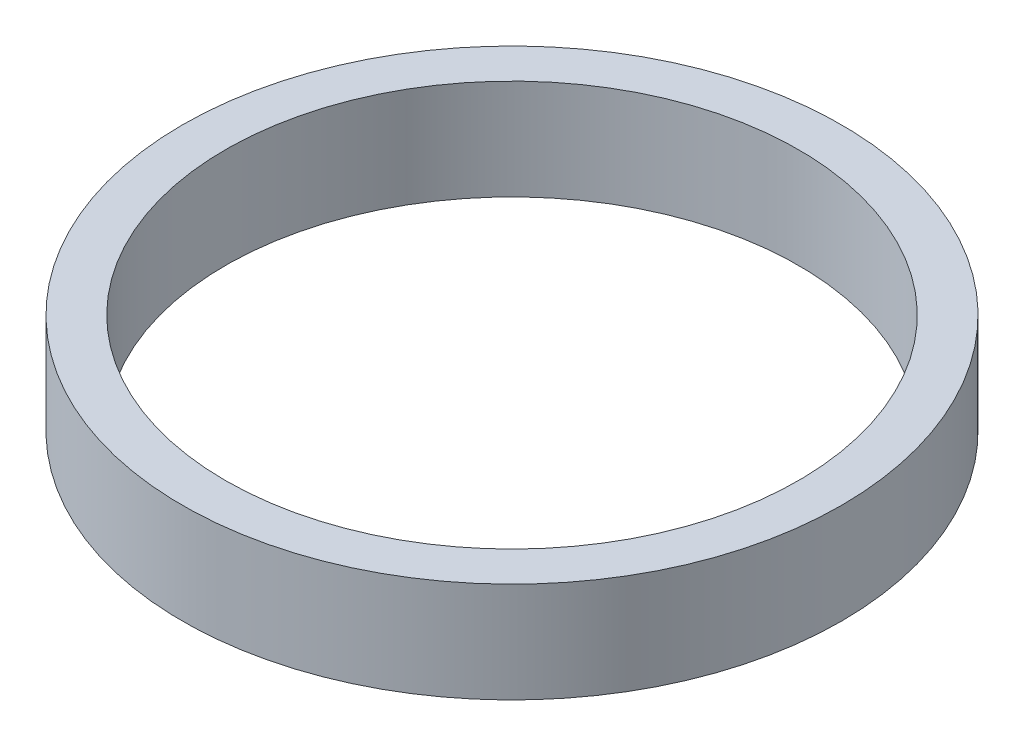
ISO-10303-21;
HEADER;
FILE_DESCRIPTION(('STEP AP214'),'2;1');
FILE_NAME('part.step','',(''),(''),'','','');
FILE_SCHEMA(('AUTOMOTIVE_DESIGN { 1 0 10303 214 1 1 1 1 }'));
ENDSEC;
DATA;
#1=APPLICATION_CONTEXT('core data for automotive mechanical design processes');
#2=APPLICATION_PROTOCOL_DEFINITION('international standard','automotive_design',2000,#1);
#3=PRODUCT_CONTEXT('',#1,'mechanical');
#4=PRODUCT('Part','Part','',(#3));
#5=PRODUCT_RELATED_PRODUCT_CATEGORY('part','',(#4));
#6=PRODUCT_DEFINITION_FORMATION('','',#4);
#7=PRODUCT_DEFINITION_CONTEXT('part definition',#1,'design');
#8=PRODUCT_DEFINITION('design','',#6,#7);
#9=PRODUCT_DEFINITION_SHAPE('','',#8);
#10=(LENGTH_UNIT() NAMED_UNIT(*) SI_UNIT(.MILLI.,.METRE.));
#11=(NAMED_UNIT(*) PLANE_ANGLE_UNIT() SI_UNIT($,.RADIAN.));
#12=(NAMED_UNIT(*) SI_UNIT($,.STERADIAN.) SOLID_ANGLE_UNIT());
#13=UNCERTAINTY_MEASURE_WITH_UNIT(LENGTH_MEASURE(1.E-05),#10,'distance_accuracy_value','');
#14=(GEOMETRIC_REPRESENTATION_CONTEXT(3) GLOBAL_UNCERTAINTY_ASSIGNED_CONTEXT((#13)) GLOBAL_UNIT_ASSIGNED_CONTEXT((#10,
#11,#12)) REPRESENTATION_CONTEXT('',''));
#15=CARTESIAN_POINT('',(0.,0.,0.));
#16=DIRECTION('',(0.,0.,1.));
#17=DIRECTION('',(1.,0.,0.));
#18=AXIS2_PLACEMENT_3D('',#15,#16,#17);
#19=CARTESIAN_POINT('',(0.,3.5,0.));
#20=DIRECTION('',(0.,1.,0.));
#21=DIRECTION('',(0.,0.,1.));
#22=AXIS2_PLACEMENT_3D('',#19,#20,#21);
#23=PLANE('',#22);
#24=CARTESIAN_POINT('',(0.,3.5,0.));
#25=DIRECTION('',(0.,1.,0.));
#26=DIRECTION('',(1.,0.,0.));
#27=AXIS2_PLACEMENT_3D('',#24,#25,#26);
#28=CIRCLE('',#27,11.5);
#29=CARTESIAN_POINT('',(11.5,3.5,0.));
#30=VERTEX_POINT('',#29);
#31=EDGE_CURVE('E13',#30,#30,#28,.T.);
#32=ORIENTED_EDGE('',*,*,#31,.T.);
#33=EDGE_LOOP('',(#32));
#34=FACE_BOUND('',#33,.T.);
#35=CARTESIAN_POINT('',(0.,3.5,0.));
#36=DIRECTION('',(0.,1.,0.));
#37=DIRECTION('',(0.,0.,1.));
#38=AXIS2_PLACEMENT_3D('',#35,#36,#37);
#39=CIRCLE('',#38,10.);
#40=CARTESIAN_POINT('',(0.,3.5,10.));
#41=VERTEX_POINT('',#40);
#42=EDGE_CURVE('E63',#41,#41,#39,.T.);
#43=ORIENTED_EDGE('',*,*,#42,.F.);
#44=EDGE_LOOP('',(#43));
#45=FACE_BOUND('',#44,.T.);
#46=ADVANCED_FACE('F52',(#34,#45),#23,.T.);
#47=CARTESIAN_POINT('',(0.,0.,0.));
#48=DIRECTION('',(0.,1.,0.));
#49=DIRECTION('',(0.,0.,1.));
#50=AXIS2_PLACEMENT_3D('',#47,#48,#49);
#51=PLANE('',#50);
#52=CARTESIAN_POINT('',(0.,0.,0.));
#53=DIRECTION('',(0.,1.,0.));
#54=DIRECTION('',(1.,0.,0.));
#55=AXIS2_PLACEMENT_3D('',#52,#53,#54);
#56=CIRCLE('',#55,11.5);
#57=CARTESIAN_POINT('',(11.5,0.,0.));
#58=VERTEX_POINT('',#57);
#59=EDGE_CURVE('E56',#58,#58,#56,.T.);
#60=ORIENTED_EDGE('',*,*,#59,.F.);
#61=EDGE_LOOP('',(#60));
#62=FACE_BOUND('',#61,.T.);
#63=CARTESIAN_POINT('',(0.,0.,0.));
#64=DIRECTION('',(0.,1.,0.));
#65=DIRECTION('',(0.,0.,1.));
#66=AXIS2_PLACEMENT_3D('',#63,#64,#65);
#67=CIRCLE('',#66,10.);
#68=CARTESIAN_POINT('',(0.,0.,10.));
#69=VERTEX_POINT('',#68);
#70=EDGE_CURVE('E65',#69,#69,#67,.T.);
#71=ORIENTED_EDGE('',*,*,#70,.T.);
#72=EDGE_LOOP('',(#71));
#73=FACE_BOUND('',#72,.T.);
#74=ADVANCED_FACE('F75',(#62,#73),#51,.F.);
#75=CARTESIAN_POINT('',(0.,3.5,0.));
#76=DIRECTION('',(0.,-1.,0.));
#77=DIRECTION('',(0.,0.,-1.));
#78=AXIS2_PLACEMENT_3D('',#75,#76,#77);
#79=CYLINDRICAL_SURFACE('',#78,11.5);
#80=ORIENTED_EDGE('',*,*,#31,.F.);
#81=EDGE_LOOP('',(#80));
#82=FACE_BOUND('',#81,.T.);
#83=ORIENTED_EDGE('',*,*,#59,.T.);
#84=EDGE_LOOP('',(#83));
#85=FACE_BOUND('',#84,.T.);
#86=ADVANCED_FACE('F54',(#82,#85),#79,.T.);
#87=CARTESIAN_POINT('',(0.,3.5,0.));
#88=DIRECTION('',(0.,-1.,0.));
#89=DIRECTION('',(0.,0.,-1.));
#90=AXIS2_PLACEMENT_3D('',#87,#88,#89);
#91=CYLINDRICAL_SURFACE('',#90,10.);
#92=ORIENTED_EDGE('',*,*,#42,.T.);
#93=EDGE_LOOP('',(#92));
#94=FACE_BOUND('',#93,.T.);
#95=ORIENTED_EDGE('',*,*,#70,.F.);
#96=EDGE_LOOP('',(#95));
#97=FACE_BOUND('',#96,.T.);
#98=ADVANCED_FACE('F71',(#94,#97),#91,.F.);
#99=CLOSED_SHELL('',(#46,#74,#86,#98));
#100=MANIFOLD_SOLID_BREP('B2',#99);
#101=ADVANCED_BREP_SHAPE_REPRESENTATION('',(#18,#100),#14);
#102=SHAPE_DEFINITION_REPRESENTATION(#9,#101);
ENDSEC;
END-ISO-10303-21;
